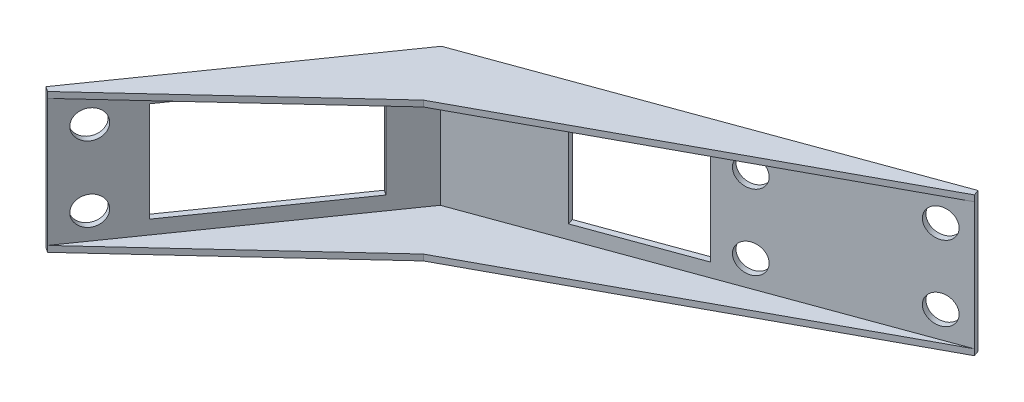
ISO-10303-21;
HEADER;
FILE_DESCRIPTION(('STEP AP214'),'2;1');
FILE_NAME('part.step','',(''),(''),'','','');
FILE_SCHEMA(('AUTOMOTIVE_DESIGN { 1 0 10303 214 1 1 1 1 }'));
ENDSEC;
DATA;
#1=APPLICATION_CONTEXT('core data for automotive mechanical design processes');
#2=APPLICATION_PROTOCOL_DEFINITION('international standard','automotive_design',2000,#1);
#3=PRODUCT_CONTEXT('',#1,'mechanical');
#4=PRODUCT('Part','Part','',(#3));
#5=PRODUCT_RELATED_PRODUCT_CATEGORY('part','',(#4));
#6=PRODUCT_DEFINITION_FORMATION('','',#4);
#7=PRODUCT_DEFINITION_CONTEXT('part definition',#1,'design');
#8=PRODUCT_DEFINITION('design','',#6,#7);
#9=PRODUCT_DEFINITION_SHAPE('','',#8);
#10=(LENGTH_UNIT() NAMED_UNIT(*) SI_UNIT(.MILLI.,.METRE.));
#11=(NAMED_UNIT(*) PLANE_ANGLE_UNIT() SI_UNIT($,.RADIAN.));
#12=(NAMED_UNIT(*) SI_UNIT($,.STERADIAN.) SOLID_ANGLE_UNIT());
#13=UNCERTAINTY_MEASURE_WITH_UNIT(LENGTH_MEASURE(1.E-05),#10,'distance_accuracy_value','');
#14=(GEOMETRIC_REPRESENTATION_CONTEXT(3) GLOBAL_UNCERTAINTY_ASSIGNED_CONTEXT((#13)) GLOBAL_UNIT_ASSIGNED_CONTEXT((#10,
#11,#12)) REPRESENTATION_CONTEXT('',''));
#15=CARTESIAN_POINT('',(0.,0.,0.));
#16=DIRECTION('',(0.,0.,1.));
#17=DIRECTION('',(1.,0.,0.));
#18=AXIS2_PLACEMENT_3D('',#15,#16,#17);
#19=CARTESIAN_POINT('',(65.7404837524063,26.65,-35.7689616644613));
#20=DIRECTION('',(-0.939464857122452,0.,0.342645271719736));
#21=DIRECTION('',(0.342645271719736,0.,0.939464857122451));
#22=AXIS2_PLACEMENT_3D('',#19,#20,#21);
#23=PLANE('',#22);
#24=DIRECTION('',(0.,-1.,0.));
#25=VECTOR('',#24,1.);
#26=CARTESIAN_POINT('',(65.7404837524063,26.65,-35.7689616644613));
#27=LINE('',#26,#25);
#28=CARTESIAN_POINT('',(65.7404837524063,26.65,-35.7689616644613));
#29=VERTEX_POINT('',#28);
#30=CARTESIAN_POINT('',(65.7404837524063,0.,-35.7689616644613));
#31=VERTEX_POINT('',#30);
#32=EDGE_CURVE('E223',#29,#31,#27,.T.);
#33=ORIENTED_EDGE('',*,*,#32,.T.);
#34=DIRECTION('',(0.,1.,0.));
#35=VECTOR('',#34,1.);
#36=CARTESIAN_POINT('',(65.7404837524063,-1.25,-35.7689616644613));
#37=LINE('',#36,#35);
#38=CARTESIAN_POINT('',(65.7404837524063,-1.25,-35.7689616644613));
#39=VERTEX_POINT('',#38);
#40=EDGE_CURVE('E175',#39,#31,#37,.T.);
#41=ORIENTED_EDGE('',*,*,#40,.F.);
#42=DIRECTION('',(0.342645271719736,0.,0.939464857122451));
#43=VECTOR('',#42,1.);
#44=CARTESIAN_POINT('',(65.3121771627561,-1.25,-36.943292735866));
#45=LINE('',#44,#43);
#46=CARTESIAN_POINT('',(65.3121771627561,-1.25,-36.943292735866));
#47=VERTEX_POINT('',#46);
#48=EDGE_CURVE('E190',#47,#39,#45,.T.);
#49=ORIENTED_EDGE('',*,*,#48,.F.);
#50=DIRECTION('',(0.,-1.,0.));
#51=VECTOR('',#50,1.);
#52=CARTESIAN_POINT('',(65.3121771627561,26.65,-36.943292735866));
#53=LINE('',#52,#51);
#54=CARTESIAN_POINT('',(65.3121771627561,27.9,-36.943292735866));
#55=VERTEX_POINT('',#54);
#56=EDGE_CURVE('E238',#55,#47,#53,.T.);
#57=ORIENTED_EDGE('',*,*,#56,.F.);
#58=DIRECTION('',(-0.342645271719736,0.,-0.939464857122451));
#59=VECTOR('',#58,1.);
#60=CARTESIAN_POINT('',(65.3121771627561,27.9,-36.943292735866));
#61=LINE('',#60,#59);
#62=CARTESIAN_POINT('',(65.7404837524063,27.9,-35.7689616644613));
#63=VERTEX_POINT('',#62);
#64=EDGE_CURVE('E204',#63,#55,#61,.T.);
#65=ORIENTED_EDGE('',*,*,#64,.F.);
#66=DIRECTION('',(0.,-1.,0.));
#67=VECTOR('',#66,1.);
#68=CARTESIAN_POINT('',(65.7404837524063,27.9,-35.7689616644613));
#69=LINE('',#68,#67);
#70=EDGE_CURVE('E210',#63,#29,#69,.T.);
#71=ORIENTED_EDGE('',*,*,#70,.T.);
#72=EDGE_LOOP('',(#33,#41,#49,#57,#65,#71));
#73=FACE_BOUND('',#72,.T.);
#74=ADVANCED_FACE('F41',(#73),#23,.F.);
#75=CARTESIAN_POINT('',(65.3121771627561,26.65,-36.943292735866));
#76=DIRECTION('',(0.342645271719738,0.,0.939464857122451));
#77=DIRECTION('',(0.939464857122451,0.,-0.342645271719738));
#78=AXIS2_PLACEMENT_3D('',#75,#76,#77);
#79=PLANE('',#78);
#80=DIRECTION('',(0.,-1.,0.));
#81=VECTOR('',#80,1.);
#82=CARTESIAN_POINT('',(24.832368991404,2.87421941666616,-22.1793398696355));
#83=LINE('',#82,#81);
#84=CARTESIAN_POINT('',(24.832368991404,23.7757805833338,-22.1793398696355));
#85=VERTEX_POINT('',#84);
#86=CARTESIAN_POINT('',(24.832368991404,2.87421941666616,-22.1793398696355));
#87=VERTEX_POINT('',#86);
#88=EDGE_CURVE('E362',#85,#87,#83,.T.);
#89=ORIENTED_EDGE('',*,*,#88,.F.);
#90=DIRECTION('',(0.939464857122451,0.,-0.342645271719738));
#91=VECTOR('',#90,1.);
#92=CARTESIAN_POINT('',(8.74010728041783,23.7757805833338,-16.3101076735159));
#93=LINE('',#92,#91);
#94=CARTESIAN_POINT('',(3.10331813768313,23.7757805833338,-14.2542360431975));
#95=VERTEX_POINT('',#94);
#96=EDGE_CURVE('E353',#95,#85,#93,.T.);
#97=ORIENTED_EDGE('',*,*,#96,.F.);
#98=DIRECTION('',(0.,1.,0.));
#99=VECTOR('',#98,1.);
#100=CARTESIAN_POINT('',(3.10331813768313,23.7757805833338,-14.2542360431975));
#101=LINE('',#100,#99);
#102=CARTESIAN_POINT('',(3.10331813768313,2.87421941666616,-14.2542360431975));
#103=VERTEX_POINT('',#102);
#104=EDGE_CURVE('E356',#103,#95,#101,.T.);
#105=ORIENTED_EDGE('',*,*,#104,.F.);
#106=DIRECTION('',(-0.939464857122451,0.,0.342645271719738));
#107=VECTOR('',#106,1.);
#108=CARTESIAN_POINT('',(3.10331813768313,2.87421941666616,-14.2542360431975));
#109=LINE('',#108,#107);
#110=EDGE_CURVE('E359',#87,#103,#109,.T.);
#111=ORIENTED_EDGE('',*,*,#110,.F.);
#112=EDGE_LOOP('',(#89,#97,#105,#111));
#113=FACE_BOUND('',#112,.T.);
#114=CARTESIAN_POINT('',(60.1451204485826,5.5,-35.0587437414075));
#115=DIRECTION('',(-0.342645271719738,0.,-0.939464857122451));
#116=DIRECTION('',(-0.939464857122451,0.,0.342645271719738));
#117=AXIS2_PLACEMENT_3D('',#114,#115,#116);
#118=CIRCLE('',#117,3.00000000000001);
#119=CARTESIAN_POINT('',(57.3267258772152,5.5,-34.0308079262482));
#120=VERTEX_POINT('',#119);
#121=EDGE_CURVE('E284',#120,#120,#118,.T.);
#122=ORIENTED_EDGE('',*,*,#121,.F.);
#123=EDGE_LOOP('',(#122));
#124=FACE_BOUND('',#123,.T.);
#125=CARTESIAN_POINT('',(31.0217098777866,5.5,-24.4367403180956));
#126=DIRECTION('',(-0.342645271719738,0.,-0.939464857122451));
#127=DIRECTION('',(-0.939464857122451,0.,0.342645271719738));
#128=AXIS2_PLACEMENT_3D('',#125,#126,#127);
#129=CIRCLE('',#128,3.);
#130=CARTESIAN_POINT('',(28.2033153064193,5.5,-23.4088045029363));
#131=VERTEX_POINT('',#130);
#132=EDGE_CURVE('E291',#131,#131,#129,.T.);
#133=ORIENTED_EDGE('',*,*,#132,.F.);
#134=EDGE_LOOP('',(#133));
#135=FACE_BOUND('',#134,.T.);
#136=CARTESIAN_POINT('',(31.0217098777866,21.15,-24.4367403180956));
#137=DIRECTION('',(-0.342645271719738,0.,-0.939464857122451));
#138=DIRECTION('',(-0.939464857122451,0.,0.342645271719738));
#139=AXIS2_PLACEMENT_3D('',#136,#137,#138);
#140=CIRCLE('',#139,3.);
#141=CARTESIAN_POINT('',(28.2033153064193,21.15,-23.4088045029363));
#142=VERTEX_POINT('',#141);
#143=EDGE_CURVE('E297',#142,#142,#140,.T.);
#144=ORIENTED_EDGE('',*,*,#143,.F.);
#145=EDGE_LOOP('',(#144));
#146=FACE_BOUND('',#145,.T.);
#147=CARTESIAN_POINT('',(60.1451204485826,21.15,-35.0587437414075));
#148=DIRECTION('',(-0.342645271719738,0.,-0.939464857122451));
#149=DIRECTION('',(-0.939464857122451,0.,0.342645271719738));
#150=AXIS2_PLACEMENT_3D('',#147,#148,#149);
#151=CIRCLE('',#150,3.00000000000001);
#152=CARTESIAN_POINT('',(57.3267258772152,21.15,-34.0308079262482));
#153=VERTEX_POINT('',#152);
#154=EDGE_CURVE('E278',#153,#153,#151,.T.);
#155=ORIENTED_EDGE('',*,*,#154,.F.);
#156=EDGE_LOOP('',(#155));
#157=FACE_BOUND('',#156,.T.);
#158=ORIENTED_EDGE('',*,*,#56,.T.);
#159=DIRECTION('',(0.939464857122451,0.,-0.342645271719738));
#160=VECTOR('',#159,1.);
#161=CARTESIAN_POINT('',(-16.9541074083159,-1.25,-6.93881389184875));
#162=LINE('',#161,#160);
#163=CARTESIAN_POINT('',(-16.9541074083159,-1.25,-6.93881389184875));
#164=VERTEX_POINT('',#163);
#165=EDGE_CURVE('E193',#164,#47,#162,.T.);
#166=ORIENTED_EDGE('',*,*,#165,.F.);
#167=DIRECTION('',(0.,-1.,0.));
#168=VECTOR('',#167,1.);
#169=CARTESIAN_POINT('',(-16.9541074083159,26.65,-6.93881389184875));
#170=LINE('',#169,#168);
#171=CARTESIAN_POINT('',(-16.9541074083159,27.9,-6.93881389184875));
#172=VERTEX_POINT('',#171);
#173=EDGE_CURVE('E236',#172,#164,#170,.T.);
#174=ORIENTED_EDGE('',*,*,#173,.F.);
#175=DIRECTION('',(-0.939464857122451,0.,0.342645271719738));
#176=VECTOR('',#175,1.);
#177=CARTESIAN_POINT('',(-16.9541074083159,27.9,-6.93881389184875));
#178=LINE('',#177,#176);
#179=EDGE_CURVE('E207',#55,#172,#178,.T.);
#180=ORIENTED_EDGE('',*,*,#179,.F.);
#181=EDGE_LOOP('',(#158,#166,#174,#180));
#182=FACE_BOUND('',#181,.T.);
#183=ADVANCED_FACE('F274',(#113,#124,#135,#146,#157,#182),#79,.F.);
#184=CARTESIAN_POINT('',(-51.0024738479846,26.65,41.7537327906224));
#185=DIRECTION('',(0.819519758435862,0.,0.573050927521478));
#186=DIRECTION('',(0.573050927521478,0.,-0.819519758435862));
#187=AXIS2_PLACEMENT_3D('',#184,#185,#186);
#188=PLANE('',#187);
#189=DIRECTION('',(0.573050927521478,0.,-0.819519758435862));
#190=VECTOR('',#189,1.);
#191=CARTESIAN_POINT('',(-21.8711764349884,23.7757805833338,0.0930833225573913));
#192=LINE('',#191,#190);
#193=CARTESIAN_POINT('',(-42.1969008210796,23.7757805833338,29.1608885366045));
#194=VERTEX_POINT('',#193);
#195=CARTESIAN_POINT('',(-21.8711764349884,23.7757805833338,0.0930833225573913));
#196=VERTEX_POINT('',#195);
#197=EDGE_CURVE('E330',#194,#196,#192,.T.);
#198=ORIENTED_EDGE('',*,*,#197,.F.);
#199=DIRECTION('',(0.,1.,0.));
#200=VECTOR('',#199,1.);
#201=CARTESIAN_POINT('',(-42.1969008210796,2.87421941666616,29.1608885366045));
#202=LINE('',#201,#200);
#203=CARTESIAN_POINT('',(-42.1969008210796,2.87421941666616,29.1608885366045));
#204=VERTEX_POINT('',#203);
#205=EDGE_CURVE('E333',#204,#194,#202,.T.);
#206=ORIENTED_EDGE('',*,*,#205,.F.);
#207=DIRECTION('',(-0.573050927521478,0.,0.819519758435862));
#208=VECTOR('',#207,1.);
#209=CARTESIAN_POINT('',(-21.8711764349884,2.87421941666616,0.0930833225573913));
#210=LINE('',#209,#208);
#211=CARTESIAN_POINT('',(-21.8711764349884,2.87421941666616,0.0930833225573913));
#212=VERTEX_POINT('',#211);
#213=EDGE_CURVE('E323',#212,#204,#210,.T.);
#214=ORIENTED_EDGE('',*,*,#213,.F.);
#215=DIRECTION('',(0.,-1.,0.));
#216=VECTOR('',#215,1.);
#217=CARTESIAN_POINT('',(-21.8711764349884,2.87421941666616,0.0930833225573913));
#218=LINE('',#217,#216);
#219=EDGE_CURVE('E327',#196,#212,#218,.T.);
#220=ORIENTED_EDGE('',*,*,#219,.F.);
#221=EDGE_LOOP('',(#198,#206,#214,#220));
#222=FACE_BOUND('',#221,.T.);
#223=CARTESIAN_POINT('',(-47.3636004582232,21.15,36.5497823245547));
#224=DIRECTION('',(-0.819519758435862,0.,-0.573050927521478));
#225=DIRECTION('',(-0.573050927521478,0.,0.819519758435862));
#226=AXIS2_PLACEMENT_3D('',#223,#224,#225);
#227=CIRCLE('',#226,3.);
#228=CARTESIAN_POINT('',(-49.0827532407876,21.15,39.0083415998623));
#229=VERTEX_POINT('',#228);
#230=EDGE_CURVE('E309',#229,#229,#227,.T.);
#231=ORIENTED_EDGE('',*,*,#230,.F.);
#232=EDGE_LOOP('',(#231));
#233=FACE_BOUND('',#232,.T.);
#234=CARTESIAN_POINT('',(-47.3636004582232,5.5,36.5497823245547));
#235=DIRECTION('',(-0.819519758435862,0.,-0.573050927521478));
#236=DIRECTION('',(-0.573050927521478,0.,0.819519758435862));
#237=AXIS2_PLACEMENT_3D('',#234,#235,#236);
#238=CIRCLE('',#237,3.);
#239=CARTESIAN_POINT('',(-49.0827532407876,5.5,39.0083415998623));
#240=VERTEX_POINT('',#239);
#241=EDGE_CURVE('E302',#240,#240,#238,.T.);
#242=ORIENTED_EDGE('',*,*,#241,.F.);
#243=EDGE_LOOP('',(#242));
#244=FACE_BOUND('',#243,.T.);
#245=ORIENTED_EDGE('',*,*,#173,.T.);
#246=DIRECTION('',(0.573050927521478,0.,-0.819519758435862));
#247=VECTOR('',#246,1.);
#248=CARTESIAN_POINT('',(-51.0024738479846,-1.25,41.7537327906224));
#249=LINE('',#248,#247);
#250=CARTESIAN_POINT('',(-51.0024738479846,-1.25,41.7537327906224));
#251=VERTEX_POINT('',#250);
#252=EDGE_CURVE('E176',#251,#164,#249,.T.);
#253=ORIENTED_EDGE('',*,*,#252,.F.);
#254=DIRECTION('',(0.,-1.,0.));
#255=VECTOR('',#254,1.);
#256=CARTESIAN_POINT('',(-51.0024738479846,26.65,41.7537327906224));
#257=LINE('',#256,#255);
#258=CARTESIAN_POINT('',(-51.0024738479846,27.9,41.7537327906224));
#259=VERTEX_POINT('',#258);
#260=EDGE_CURVE('E189',#259,#251,#257,.T.);
#261=ORIENTED_EDGE('',*,*,#260,.F.);
#262=DIRECTION('',(-0.573050927521478,0.,0.819519758435862));
#263=VECTOR('',#262,1.);
#264=CARTESIAN_POINT('',(-51.0024738479846,27.9,41.7537327906224));
#265=LINE('',#264,#263);
#266=EDGE_CURVE('E198',#172,#259,#265,.T.);
#267=ORIENTED_EDGE('',*,*,#266,.F.);
#268=EDGE_LOOP('',(#245,#253,#261,#267));
#269=FACE_BOUND('',#268,.T.);
#270=ADVANCED_FACE('F270',(#222,#233,#244,#269),#188,.F.);
#271=CARTESIAN_POINT('',(-49.9780741499398,26.65,42.4700464500242));
#272=DIRECTION('',(0.573050927521479,0.,-0.819519758435861));
#273=DIRECTION('',(-0.819519758435861,0.,-0.573050927521479));
#274=AXIS2_PLACEMENT_3D('',#271,#272,#273);
#275=PLANE('',#274);
#276=ORIENTED_EDGE('',*,*,#260,.T.);
#277=DIRECTION('',(-0.819519758435861,0.,-0.573050927521479));
#278=VECTOR('',#277,1.);
#279=CARTESIAN_POINT('',(-49.9780741499398,-1.25,42.4700464500242));
#280=LINE('',#279,#278);
#281=CARTESIAN_POINT('',(-49.9780741499398,-1.25,42.4700464500242));
#282=VERTEX_POINT('',#281);
#283=EDGE_CURVE('E182',#282,#251,#280,.T.);
#284=ORIENTED_EDGE('',*,*,#283,.F.);
#285=DIRECTION('',(0.,1.,0.));
#286=VECTOR('',#285,1.);
#287=CARTESIAN_POINT('',(-49.9780741499398,-1.25,42.4700464500242));
#288=LINE('',#287,#286);
#289=CARTESIAN_POINT('',(-49.9780741499398,0.,42.4700464500242));
#290=VERTEX_POINT('',#289);
#291=EDGE_CURVE('E164',#282,#290,#288,.T.);
#292=ORIENTED_EDGE('',*,*,#291,.T.);
#293=DIRECTION('',(0.,-1.,0.));
#294=VECTOR('',#293,1.);
#295=CARTESIAN_POINT('',(-49.9780741499398,26.65,42.4700464500242));
#296=LINE('',#295,#294);
#297=CARTESIAN_POINT('',(-49.9780741499398,26.65,42.4700464500242));
#298=VERTEX_POINT('',#297);
#299=EDGE_CURVE('E233',#298,#290,#296,.T.);
#300=ORIENTED_EDGE('',*,*,#299,.F.);
#301=DIRECTION('',(0.,-1.,0.));
#302=VECTOR('',#301,1.);
#303=CARTESIAN_POINT('',(-49.9780741499398,27.9,42.4700464500242));
#304=LINE('',#303,#302);
#305=CARTESIAN_POINT('',(-49.9780741499398,27.9,42.4700464500242));
#306=VERTEX_POINT('',#305);
#307=EDGE_CURVE('E213',#306,#298,#304,.T.);
#308=ORIENTED_EDGE('',*,*,#307,.F.);
#309=DIRECTION('',(0.819519758435861,0.,0.573050927521479));
#310=VECTOR('',#309,1.);
#311=CARTESIAN_POINT('',(-51.0024738479846,27.9,41.7537327906224));
#312=LINE('',#311,#310);
#313=EDGE_CURVE('E201',#259,#306,#312,.T.);
#314=ORIENTED_EDGE('',*,*,#313,.F.);
#315=EDGE_LOOP('',(#276,#284,#292,#300,#308,#314));
#316=FACE_BOUND('',#315,.T.);
#317=ADVANCED_FACE('F187',(#316),#275,.F.);
#318=CARTESIAN_POINT('',(-49.9780741499398,26.65,42.4700464500242));
#319=DIRECTION('',(-0.819519758435862,0.,-0.573050927521478));
#320=DIRECTION('',(-0.573050927521478,0.,0.819519758435862));
#321=AXIS2_PLACEMENT_3D('',#318,#319,#320);
#322=PLANE('',#321);
#323=DIRECTION('',(-0.573050927521478,0.,0.819519758435862));
#324=VECTOR('',#323,1.);
#325=CARTESIAN_POINT('',(-20.8467767369436,2.87421941666616,0.809396981959239));
#326=LINE('',#325,#324);
#327=CARTESIAN_POINT('',(-20.8467767369436,2.87421941666616,0.809396981959239));
#328=VERTEX_POINT('',#327);
#329=CARTESIAN_POINT('',(-41.1725011230348,2.87421941666616,29.8772021960063));
#330=VERTEX_POINT('',#329);
#331=EDGE_CURVE('E318',#328,#330,#326,.T.);
#332=ORIENTED_EDGE('',*,*,#331,.T.);
#333=DIRECTION('',(0.,1.,0.));
#334=VECTOR('',#333,1.);
#335=CARTESIAN_POINT('',(-41.1725011230348,2.87421941666616,29.8772021960063));
#336=LINE('',#335,#334);
#337=CARTESIAN_POINT('',(-41.1725011230348,23.7757805833338,29.8772021960063));
#338=VERTEX_POINT('',#337);
#339=EDGE_CURVE('E326',#330,#338,#336,.T.);
#340=ORIENTED_EDGE('',*,*,#339,.T.);
#341=DIRECTION('',(0.573050927521478,0.,-0.819519758435862));
#342=VECTOR('',#341,1.);
#343=CARTESIAN_POINT('',(-20.8467767369436,23.7757805833338,0.809396981959239));
#344=LINE('',#343,#342);
#345=CARTESIAN_POINT('',(-20.8467767369436,23.7757805833338,0.809396981959074));
#346=VERTEX_POINT('',#345);
#347=EDGE_CURVE('E341',#338,#346,#344,.T.);
#348=ORIENTED_EDGE('',*,*,#347,.T.);
#349=DIRECTION('',(0.,-1.,0.));
#350=VECTOR('',#349,1.);
#351=CARTESIAN_POINT('',(-20.8467767369436,2.87421941666616,0.809396981959239));
#352=LINE('',#351,#350);
#353=EDGE_CURVE('E338',#346,#328,#352,.T.);
#354=ORIENTED_EDGE('',*,*,#353,.T.);
#355=EDGE_LOOP('',(#332,#340,#348,#354));
#356=FACE_BOUND('',#355,.T.);
#357=CARTESIAN_POINT('',(-46.3392007601784,21.15,37.2660959839566));
#358=DIRECTION('',(-0.819519758435862,0.,-0.573050927521478));
#359=DIRECTION('',(-0.573050927521478,0.,0.819519758435862));
#360=AXIS2_PLACEMENT_3D('',#357,#358,#359);
#361=CIRCLE('',#360,3.);
#362=CARTESIAN_POINT('',(-48.0583535427428,21.15,39.7246552592642));
#363=VERTEX_POINT('',#362);
#364=EDGE_CURVE('E288',#363,#363,#361,.T.);
#365=ORIENTED_EDGE('',*,*,#364,.T.);
#366=EDGE_LOOP('',(#365));
#367=FACE_BOUND('',#366,.T.);
#368=CARTESIAN_POINT('',(-46.3392007601784,5.5,37.2660959839566));
#369=DIRECTION('',(-0.819519758435862,0.,-0.573050927521478));
#370=DIRECTION('',(-0.573050927521478,0.,0.819519758435862));
#371=AXIS2_PLACEMENT_3D('',#368,#369,#370);
#372=CIRCLE('',#371,3.);
#373=CARTESIAN_POINT('',(-48.0583535427428,5.5,39.7246552592642));
#374=VERTEX_POINT('',#373);
#375=EDGE_CURVE('E305',#374,#374,#372,.T.);
#376=ORIENTED_EDGE('',*,*,#375,.T.);
#377=EDGE_LOOP('',(#376));
#378=FACE_BOUND('',#377,.T.);
#379=DIRECTION('',(0.573050927521478,0.,-0.819519758435862));
#380=VECTOR('',#379,1.);
#381=CARTESIAN_POINT('',(-49.9780741499398,0.,42.4700464500242));
#382=LINE('',#381,#380);
#383=CARTESIAN_POINT('',(-16.1555511111306,0.,-5.89952173188478));
#384=VERTEX_POINT('',#383);
#385=EDGE_CURVE('E215',#290,#384,#382,.T.);
#386=ORIENTED_EDGE('',*,*,#385,.T.);
#387=DIRECTION('',(0.,-1.,0.));
#388=VECTOR('',#387,1.);
#389=CARTESIAN_POINT('',(-16.1555511111306,26.65,-5.89952173188478));
#390=LINE('',#389,#388);
#391=CARTESIAN_POINT('',(-16.1555511111306,26.65,-5.89952173188478));
#392=VERTEX_POINT('',#391);
#393=EDGE_CURVE('E230',#392,#384,#390,.T.);
#394=ORIENTED_EDGE('',*,*,#393,.F.);
#395=DIRECTION('',(0.573050927521478,0.,-0.819519758435862));
#396=VECTOR('',#395,1.);
#397=CARTESIAN_POINT('',(-49.9780741499398,26.65,42.4700464500242));
#398=LINE('',#397,#396);
#399=EDGE_CURVE('E216',#298,#392,#398,.T.);
#400=ORIENTED_EDGE('',*,*,#399,.F.);
#401=ORIENTED_EDGE('',*,*,#299,.T.);
#402=EDGE_LOOP('',(#386,#394,#400,#401));
#403=FACE_BOUND('',#402,.T.);
#404=ADVANCED_FACE('F242',(#356,#367,#378,#403),#322,.F.);
#405=CARTESIAN_POINT('',(65.7404837524063,26.65,-35.7689616644613));
#406=DIRECTION('',(-0.342645271719737,0.,-0.939464857122451));
#407=DIRECTION('',(-0.939464857122451,0.,0.342645271719737));
#408=AXIS2_PLACEMENT_3D('',#405,#406,#407);
#409=PLANE('',#408);
#410=DIRECTION('',(0.,1.,0.));
#411=VECTOR('',#410,1.);
#412=CARTESIAN_POINT('',(3.5316247273328,23.7757805833338,-13.0799049717944));
#413=LINE('',#412,#411);
#414=CARTESIAN_POINT('',(3.5316247273328,2.87421941666616,-13.0799049717944));
#415=VERTEX_POINT('',#414);
#416=CARTESIAN_POINT('',(3.5316247273328,23.7757805833338,-13.0799049717944));
#417=VERTEX_POINT('',#416);
#418=EDGE_CURVE('E348',#415,#417,#413,.T.);
#419=ORIENTED_EDGE('',*,*,#418,.T.);
#420=DIRECTION('',(0.939464857122451,0.,-0.342645271719739));
#421=VECTOR('',#420,1.);
#422=CARTESIAN_POINT('',(25.2606755810537,23.7757805833338,-21.0050087982325));
#423=LINE('',#422,#421);
#424=CARTESIAN_POINT('',(25.2606755810537,23.7757805833338,-21.0050087982325));
#425=VERTEX_POINT('',#424);
#426=EDGE_CURVE('E355',#417,#425,#423,.T.);
#427=ORIENTED_EDGE('',*,*,#426,.T.);
#428=DIRECTION('',(0.,-1.,0.));
#429=VECTOR('',#428,1.);
#430=CARTESIAN_POINT('',(25.2606755810537,2.87421941666616,-21.0050087982325));
#431=LINE('',#430,#429);
#432=CARTESIAN_POINT('',(25.2606755810542,2.87421941666616,-21.0050087982309));
#433=VERTEX_POINT('',#432);
#434=EDGE_CURVE('E370',#425,#433,#431,.T.);
#435=ORIENTED_EDGE('',*,*,#434,.T.);
#436=DIRECTION('',(-0.939464857122451,0.,0.342645271719739));
#437=VECTOR('',#436,1.);
#438=CARTESIAN_POINT('',(25.2606755810537,2.87421941666616,-21.0050087982325));
#439=LINE('',#438,#437);
#440=EDGE_CURVE('E367',#433,#415,#439,.T.);
#441=ORIENTED_EDGE('',*,*,#440,.T.);
#442=EDGE_LOOP('',(#419,#427,#435,#441));
#443=FACE_BOUND('',#442,.T.);
#444=CARTESIAN_POINT('',(60.5734270382323,5.5,-33.8844126700044));
#445=DIRECTION('',(-0.342645271719738,0.,-0.939464857122451));
#446=DIRECTION('',(-0.939464857122451,0.,0.342645271719738));
#447=AXIS2_PLACEMENT_3D('',#444,#445,#446);
#448=CIRCLE('',#447,3.00000000000001);
#449=CARTESIAN_POINT('',(57.7550324668649,5.5,-32.8564768548452));
#450=VERTEX_POINT('',#449);
#451=EDGE_CURVE('E287',#450,#450,#448,.T.);
#452=ORIENTED_EDGE('',*,*,#451,.T.);
#453=EDGE_LOOP('',(#452));
#454=FACE_BOUND('',#453,.T.);
#455=CARTESIAN_POINT('',(31.4500164674363,5.5,-23.2624092466925));
#456=DIRECTION('',(-0.342645271719738,0.,-0.939464857122451));
#457=DIRECTION('',(-0.939464857122451,0.,0.342645271719738));
#458=AXIS2_PLACEMENT_3D('',#455,#456,#457);
#459=CIRCLE('',#458,3.);
#460=CARTESIAN_POINT('',(28.6316218960689,5.5,-22.2344734315333));
#461=VERTEX_POINT('',#460);
#462=EDGE_CURVE('E294',#461,#461,#459,.T.);
#463=ORIENTED_EDGE('',*,*,#462,.T.);
#464=EDGE_LOOP('',(#463));
#465=FACE_BOUND('',#464,.T.);
#466=CARTESIAN_POINT('',(31.4500164674363,21.15,-23.2624092466925));
#467=DIRECTION('',(-0.342645271719738,0.,-0.939464857122451));
#468=DIRECTION('',(-0.939464857122451,0.,0.342645271719738));
#469=AXIS2_PLACEMENT_3D('',#466,#467,#468);
#470=CIRCLE('',#469,3.);
#471=CARTESIAN_POINT('',(28.6316218960689,21.15,-22.2344734315333));
#472=VERTEX_POINT('',#471);
#473=EDGE_CURVE('E282',#472,#472,#470,.T.);
#474=ORIENTED_EDGE('',*,*,#473,.T.);
#475=EDGE_LOOP('',(#474));
#476=FACE_BOUND('',#475,.T.);
#477=CARTESIAN_POINT('',(60.5734270382323,21.15,-33.8844126700044));
#478=DIRECTION('',(-0.342645271719738,0.,-0.939464857122451));
#479=DIRECTION('',(-0.939464857122451,0.,0.342645271719738));
#480=AXIS2_PLACEMENT_3D('',#477,#478,#479);
#481=CIRCLE('',#480,3.00000000000001);
#482=CARTESIAN_POINT('',(57.7550324668649,21.15,-32.8564768548452));
#483=VERTEX_POINT('',#482);
#484=EDGE_CURVE('E276',#483,#483,#481,.T.);
#485=ORIENTED_EDGE('',*,*,#484,.T.);
#486=EDGE_LOOP('',(#485));
#487=FACE_BOUND('',#486,.T.);
#488=DIRECTION('',(0.939464857122451,0.,-0.342645271719737));
#489=VECTOR('',#488,1.);
#490=CARTESIAN_POINT('',(65.7404837524063,0.,-35.7689616644613));
#491=LINE('',#490,#489);
#492=EDGE_CURVE('E220',#384,#31,#491,.T.);
#493=ORIENTED_EDGE('',*,*,#492,.T.);
#494=ORIENTED_EDGE('',*,*,#32,.F.);
#495=DIRECTION('',(0.939464857122451,0.,-0.342645271719737));
#496=VECTOR('',#495,1.);
#497=CARTESIAN_POINT('',(65.7404837524063,26.65,-35.7689616644613));
#498=LINE('',#497,#496);
#499=EDGE_CURVE('E219',#392,#29,#498,.T.);
#500=ORIENTED_EDGE('',*,*,#499,.F.);
#501=ORIENTED_EDGE('',*,*,#393,.T.);
#502=EDGE_LOOP('',(#493,#494,#500,#501));
#503=FACE_BOUND('',#502,.T.);
#504=ADVANCED_FACE('F246',(#443,#454,#465,#476,#487,#503),#409,.F.);
#505=CARTESIAN_POINT('',(0.,27.9,0.));
#506=DIRECTION('',(0.,-1.,0.));
#507=DIRECTION('',(0.,0.,-1.));
#508=AXIS2_PLACEMENT_3D('',#505,#506,#507);
#509=PLANE('',#508);
#510=DIRECTION('',(0.734647099346202,0.,-0.678449437631288));
#511=VECTOR('',#510,1.);
#512=CARTESIAN_POINT('',(-1.83663038259005,27.9,-1.98876306516178));
#513=LINE('',#512,#511);
#514=CARTESIAN_POINT('',(-9.08282310460395,27.9,4.7031239396238));
#515=VERTEX_POINT('',#514);
#516=EDGE_CURVE('E257',#306,#515,#513,.T.);
#517=ORIENTED_EDGE('',*,*,#516,.T.);
#518=DIRECTION('',(0.879573438435132,0.,-0.475763141068536));
#519=VECTOR('',#518,1.);
#520=CARTESIAN_POINT('',(-0.0877923607328361,27.9,-0.162307295232428));
#521=LINE('',#520,#519);
#522=EDGE_CURVE('E364',#515,#63,#521,.T.);
#523=ORIENTED_EDGE('',*,*,#522,.T.);
#524=ORIENTED_EDGE('',*,*,#64,.T.);
#525=ORIENTED_EDGE('',*,*,#179,.T.);
#526=ORIENTED_EDGE('',*,*,#266,.T.);
#527=ORIENTED_EDGE('',*,*,#313,.T.);
#528=EDGE_LOOP('',(#517,#523,#524,#525,#526,#527));
#529=FACE_BOUND('',#528,.T.);
#530=ADVANCED_FACE('F266',(#529),#509,.F.);
#531=CARTESIAN_POINT('',(0.,26.65,0.));
#532=DIRECTION('',(0.,-1.,0.));
#533=DIRECTION('',(0.,0.,-1.));
#534=AXIS2_PLACEMENT_3D('',#531,#532,#533);
#535=PLANE('',#534);
#536=DIRECTION('',(0.879573438435132,0.,-0.475763141068536));
#537=VECTOR('',#536,1.);
#538=CARTESIAN_POINT('',(-0.0877923607328361,26.65,-0.162307295232428));
#539=LINE('',#538,#537);
#540=CARTESIAN_POINT('',(-9.08282310460395,26.65,4.7031239396238));
#541=VERTEX_POINT('',#540);
#542=EDGE_CURVE('E253',#541,#29,#539,.T.);
#543=ORIENTED_EDGE('',*,*,#542,.F.);
#544=DIRECTION('',(0.734647099346202,0.,-0.678449437631288));
#545=VECTOR('',#544,1.);
#546=CARTESIAN_POINT('',(-1.83663038259005,26.65,-1.98876306516178));
#547=LINE('',#546,#545);
#548=EDGE_CURVE('E252',#298,#541,#547,.T.);
#549=ORIENTED_EDGE('',*,*,#548,.F.);
#550=ORIENTED_EDGE('',*,*,#399,.T.);
#551=ORIENTED_EDGE('',*,*,#499,.T.);
#552=EDGE_LOOP('',(#543,#549,#550,#551));
#553=FACE_BOUND('',#552,.T.);
#554=ADVANCED_FACE('F251',(#553),#535,.T.);
#555=CARTESIAN_POINT('',(0.,-1.25,0.));
#556=DIRECTION('',(0.,-1.,0.));
#557=DIRECTION('',(0.,0.,-1.));
#558=AXIS2_PLACEMENT_3D('',#555,#556,#557);
#559=PLANE('',#558);
#560=DIRECTION('',(0.879573438435132,0.,-0.475763141068536));
#561=VECTOR('',#560,1.);
#562=CARTESIAN_POINT('',(65.7404837524063,-1.25,-35.7689616644613));
#563=LINE('',#562,#561);
#564=CARTESIAN_POINT('',(-9.08282310460395,-1.25,4.7031239396238));
#565=VERTEX_POINT('',#564);
#566=EDGE_CURVE('E185',#565,#39,#563,.T.);
#567=ORIENTED_EDGE('',*,*,#566,.F.);
#568=DIRECTION('',(0.734647099346202,0.,-0.678449437631288));
#569=VECTOR('',#568,1.);
#570=CARTESIAN_POINT('',(-9.08282310460395,-1.25,4.7031239396238));
#571=LINE('',#570,#569);
#572=EDGE_CURVE('E167',#282,#565,#571,.T.);
#573=ORIENTED_EDGE('',*,*,#572,.F.);
#574=ORIENTED_EDGE('',*,*,#283,.T.);
#575=ORIENTED_EDGE('',*,*,#252,.T.);
#576=ORIENTED_EDGE('',*,*,#165,.T.);
#577=ORIENTED_EDGE('',*,*,#48,.T.);
#578=EDGE_LOOP('',(#567,#573,#574,#575,#576,#577));
#579=FACE_BOUND('',#578,.T.);
#580=ADVANCED_FACE('F180',(#579),#559,.T.);
#581=CARTESIAN_POINT('',(0.,0.,0.));
#582=DIRECTION('',(0.,-1.,0.));
#583=DIRECTION('',(0.,0.,-1.));
#584=AXIS2_PLACEMENT_3D('',#581,#582,#583);
#585=PLANE('',#584);
#586=DIRECTION('',(0.734647099346202,0.,-0.678449437631288));
#587=VECTOR('',#586,1.);
#588=CARTESIAN_POINT('',(-1.83663038259005,0.,-1.98876306516178));
#589=LINE('',#588,#587);
#590=CARTESIAN_POINT('',(-9.08282310460395,0.,4.7031239396238));
#591=VERTEX_POINT('',#590);
#592=EDGE_CURVE('E48',#290,#591,#589,.T.);
#593=ORIENTED_EDGE('',*,*,#592,.T.);
#594=DIRECTION('',(0.879573438435132,0.,-0.475763141068536));
#595=VECTOR('',#594,1.);
#596=CARTESIAN_POINT('',(-0.0877923607328361,0.,-0.162307295232428));
#597=LINE('',#596,#595);
#598=EDGE_CURVE('E11',#591,#31,#597,.T.);
#599=ORIENTED_EDGE('',*,*,#598,.T.);
#600=ORIENTED_EDGE('',*,*,#492,.F.);
#601=ORIENTED_EDGE('',*,*,#385,.F.);
#602=EDGE_LOOP('',(#593,#599,#600,#601));
#603=FACE_BOUND('',#602,.T.);
#604=ADVANCED_FACE('F240',(#603),#585,.F.);
#605=CARTESIAN_POINT('',(60.5734270382323,21.15,-33.8844126700044));
#606=DIRECTION('',(-0.342645271719738,0.,-0.939464857122451));
#607=DIRECTION('',(-0.939464857122451,0.,0.342645271719738));
#608=AXIS2_PLACEMENT_3D('',#605,#606,#607);
#609=CYLINDRICAL_SURFACE('',#608,3.00000000000001);
#610=ORIENTED_EDGE('',*,*,#484,.F.);
#611=EDGE_LOOP('',(#610));
#612=FACE_BOUND('',#611,.T.);
#613=ORIENTED_EDGE('',*,*,#154,.T.);
#614=EDGE_LOOP('',(#613));
#615=FACE_BOUND('',#614,.T.);
#616=ADVANCED_FACE('F419',(#612,#615),#609,.F.);
#617=CARTESIAN_POINT('',(31.4500164674363,21.15,-23.2624092466925));
#618=DIRECTION('',(-0.342645271719738,0.,-0.939464857122451));
#619=DIRECTION('',(-0.939464857122451,0.,0.342645271719738));
#620=AXIS2_PLACEMENT_3D('',#617,#618,#619);
#621=CYLINDRICAL_SURFACE('',#620,3.);
#622=ORIENTED_EDGE('',*,*,#473,.F.);
#623=EDGE_LOOP('',(#622));
#624=FACE_BOUND('',#623,.T.);
#625=ORIENTED_EDGE('',*,*,#143,.T.);
#626=EDGE_LOOP('',(#625));
#627=FACE_BOUND('',#626,.T.);
#628=ADVANCED_FACE('F424',(#624,#627),#621,.F.);
#629=CARTESIAN_POINT('',(31.4500164674363,5.5,-23.2624092466925));
#630=DIRECTION('',(-0.342645271719738,0.,-0.939464857122451));
#631=DIRECTION('',(-0.939464857122451,0.,0.342645271719738));
#632=AXIS2_PLACEMENT_3D('',#629,#630,#631);
#633=CYLINDRICAL_SURFACE('',#632,3.);
#634=ORIENTED_EDGE('',*,*,#462,.F.);
#635=EDGE_LOOP('',(#634));
#636=FACE_BOUND('',#635,.T.);
#637=ORIENTED_EDGE('',*,*,#132,.T.);
#638=EDGE_LOOP('',(#637));
#639=FACE_BOUND('',#638,.T.);
#640=ADVANCED_FACE('F430',(#636,#639),#633,.F.);
#641=CARTESIAN_POINT('',(60.5734270382323,5.5,-33.8844126700044));
#642=DIRECTION('',(-0.342645271719738,0.,-0.939464857122451));
#643=DIRECTION('',(-0.939464857122451,0.,0.342645271719738));
#644=AXIS2_PLACEMENT_3D('',#641,#642,#643);
#645=CYLINDRICAL_SURFACE('',#644,3.00000000000001);
#646=ORIENTED_EDGE('',*,*,#451,.F.);
#647=EDGE_LOOP('',(#646));
#648=FACE_BOUND('',#647,.T.);
#649=ORIENTED_EDGE('',*,*,#121,.T.);
#650=EDGE_LOOP('',(#649));
#651=FACE_BOUND('',#650,.T.);
#652=ADVANCED_FACE('F426',(#648,#651),#645,.F.);
#653=CARTESIAN_POINT('',(-46.3392007601784,5.5,37.2660959839566));
#654=DIRECTION('',(-0.819519758435862,0.,-0.573050927521478));
#655=DIRECTION('',(-0.573050927521478,0.,0.819519758435862));
#656=AXIS2_PLACEMENT_3D('',#653,#654,#655);
#657=CYLINDRICAL_SURFACE('',#656,3.);
#658=ORIENTED_EDGE('',*,*,#375,.F.);
#659=EDGE_LOOP('',(#658));
#660=FACE_BOUND('',#659,.T.);
#661=ORIENTED_EDGE('',*,*,#241,.T.);
#662=EDGE_LOOP('',(#661));
#663=FACE_BOUND('',#662,.T.);
#664=ADVANCED_FACE('F429',(#660,#663),#657,.F.);
#665=CARTESIAN_POINT('',(-46.3392007601784,21.15,37.2660959839566));
#666=DIRECTION('',(-0.819519758435862,0.,-0.573050927521478));
#667=DIRECTION('',(-0.573050927521478,0.,0.819519758435862));
#668=AXIS2_PLACEMENT_3D('',#665,#666,#667);
#669=CYLINDRICAL_SURFACE('',#668,3.);
#670=ORIENTED_EDGE('',*,*,#364,.F.);
#671=EDGE_LOOP('',(#670));
#672=FACE_BOUND('',#671,.T.);
#673=ORIENTED_EDGE('',*,*,#230,.T.);
#674=EDGE_LOOP('',(#673));
#675=FACE_BOUND('',#674,.T.);
#676=ADVANCED_FACE('F440',(#672,#675),#669,.F.);
#677=CARTESIAN_POINT('',(-41.1725011230348,2.87421941666616,29.8772021960063));
#678=DIRECTION('',(-0.573050927521478,0.,0.819519758435862));
#679=DIRECTION('',(0.819519758435862,0.,0.573050927521478));
#680=AXIS2_PLACEMENT_3D('',#677,#678,#679);
#681=PLANE('',#680);
#682=ORIENTED_EDGE('',*,*,#205,.T.);
#683=DIRECTION('',(-0.819519758435862,0.,-0.573050927521478));
#684=VECTOR('',#683,1.);
#685=CARTESIAN_POINT('',(-41.1725011230348,23.7757805833338,29.8772021960063));
#686=LINE('',#685,#684);
#687=EDGE_CURVE('E314',#338,#194,#686,.T.);
#688=ORIENTED_EDGE('',*,*,#687,.F.);
#689=ORIENTED_EDGE('',*,*,#339,.F.);
#690=DIRECTION('',(-0.819519758435862,0.,-0.573050927521478));
#691=VECTOR('',#690,1.);
#692=CARTESIAN_POINT('',(-41.1725011230348,2.87421941666616,29.8772021960063));
#693=LINE('',#692,#691);
#694=EDGE_CURVE('E306',#330,#204,#693,.T.);
#695=ORIENTED_EDGE('',*,*,#694,.T.);
#696=EDGE_LOOP('',(#682,#688,#689,#695));
#697=FACE_BOUND('',#696,.T.);
#698=ADVANCED_FACE('F444',(#697),#681,.F.);
#699=CARTESIAN_POINT('',(-20.8467767369436,2.87421941666616,0.809396981959239));
#700=DIRECTION('',(0.,-1.,0.));
#701=DIRECTION('',(0.,0.,-1.));
#702=AXIS2_PLACEMENT_3D('',#699,#700,#701);
#703=PLANE('',#702);
#704=ORIENTED_EDGE('',*,*,#213,.T.);
#705=ORIENTED_EDGE('',*,*,#694,.F.);
#706=ORIENTED_EDGE('',*,*,#331,.F.);
#707=DIRECTION('',(-0.819519758435862,0.,-0.573050927521478));
#708=VECTOR('',#707,1.);
#709=CARTESIAN_POINT('',(-20.8467767369436,2.87421941666616,0.809396981959239));
#710=LINE('',#709,#708);
#711=EDGE_CURVE('E320',#328,#212,#710,.T.);
#712=ORIENTED_EDGE('',*,*,#711,.T.);
#713=EDGE_LOOP('',(#704,#705,#706,#712));
#714=FACE_BOUND('',#713,.T.);
#715=ADVANCED_FACE('F448',(#714),#703,.F.);
#716=CARTESIAN_POINT('',(-20.8467767369436,2.87421941666616,0.809396981959239));
#717=DIRECTION('',(0.573050927521478,0.,-0.819519758435862));
#718=DIRECTION('',(-0.819519758435862,0.,-0.573050927521478));
#719=AXIS2_PLACEMENT_3D('',#716,#717,#718);
#720=PLANE('',#719);
#721=ORIENTED_EDGE('',*,*,#219,.T.);
#722=ORIENTED_EDGE('',*,*,#711,.F.);
#723=ORIENTED_EDGE('',*,*,#353,.F.);
#724=DIRECTION('',(-0.819519758435862,0.,-0.573050927521478));
#725=VECTOR('',#724,1.);
#726=CARTESIAN_POINT('',(-20.8467767369436,23.7757805833338,0.809396981959239));
#727=LINE('',#726,#725);
#728=EDGE_CURVE('E317',#346,#196,#727,.T.);
#729=ORIENTED_EDGE('',*,*,#728,.T.);
#730=EDGE_LOOP('',(#721,#722,#723,#729));
#731=FACE_BOUND('',#730,.T.);
#732=ADVANCED_FACE('F454',(#731),#720,.F.);
#733=CARTESIAN_POINT('',(-20.8467767369436,23.7757805833338,0.809396981959239));
#734=DIRECTION('',(0.,1.,0.));
#735=DIRECTION('',(0.,0.,1.));
#736=AXIS2_PLACEMENT_3D('',#733,#734,#735);
#737=PLANE('',#736);
#738=ORIENTED_EDGE('',*,*,#197,.T.);
#739=ORIENTED_EDGE('',*,*,#728,.F.);
#740=ORIENTED_EDGE('',*,*,#347,.F.);
#741=ORIENTED_EDGE('',*,*,#687,.T.);
#742=EDGE_LOOP('',(#738,#739,#740,#741));
#743=FACE_BOUND('',#742,.T.);
#744=ADVANCED_FACE('F450',(#743),#737,.F.);
#745=CARTESIAN_POINT('',(9.1684138700675,23.7757805833338,-15.1357766021129));
#746=DIRECTION('',(0.,1.,0.));
#747=DIRECTION('',(0.,0.,1.));
#748=AXIS2_PLACEMENT_3D('',#745,#746,#747);
#749=PLANE('',#748);
#750=ORIENTED_EDGE('',*,*,#96,.T.);
#751=DIRECTION('',(-0.342645271719738,0.,-0.939464857122451));
#752=VECTOR('',#751,1.);
#753=CARTESIAN_POINT('',(25.2606755810537,23.7757805833338,-21.0050087982325));
#754=LINE('',#753,#752);
#755=EDGE_CURVE('E63',#425,#85,#754,.T.);
#756=ORIENTED_EDGE('',*,*,#755,.F.);
#757=ORIENTED_EDGE('',*,*,#426,.F.);
#758=DIRECTION('',(-0.342645271719738,0.,-0.939464857122451));
#759=VECTOR('',#758,1.);
#760=CARTESIAN_POINT('',(3.5316247273328,23.7757805833338,-13.0799049717944));
#761=LINE('',#760,#759);
#762=EDGE_CURVE('E335',#417,#95,#761,.T.);
#763=ORIENTED_EDGE('',*,*,#762,.T.);
#764=EDGE_LOOP('',(#750,#756,#757,#763));
#765=FACE_BOUND('',#764,.T.);
#766=ADVANCED_FACE('F453',(#765),#749,.F.);
#767=CARTESIAN_POINT('',(3.5316247273328,23.7757805833338,-13.0799049717944));
#768=DIRECTION('',(-0.939464857122451,0.,0.342645271719738));
#769=DIRECTION('',(0.342645271719738,0.,0.939464857122451));
#770=AXIS2_PLACEMENT_3D('',#767,#768,#769);
#771=PLANE('',#770);
#772=ORIENTED_EDGE('',*,*,#104,.T.);
#773=ORIENTED_EDGE('',*,*,#762,.F.);
#774=ORIENTED_EDGE('',*,*,#418,.F.);
#775=DIRECTION('',(-0.342645271719738,0.,-0.939464857122451));
#776=VECTOR('',#775,1.);
#777=CARTESIAN_POINT('',(3.5316247273328,2.87421941666616,-13.0799049717944));
#778=LINE('',#777,#776);
#779=EDGE_CURVE('E350',#415,#103,#778,.T.);
#780=ORIENTED_EDGE('',*,*,#779,.T.);
#781=EDGE_LOOP('',(#772,#773,#774,#780));
#782=FACE_BOUND('',#781,.T.);
#783=ADVANCED_FACE('F468',(#782),#771,.F.);
#784=CARTESIAN_POINT('',(3.5316247273328,2.87421941666616,-13.0799049717944));
#785=DIRECTION('',(0.,-1.,0.));
#786=DIRECTION('',(0.,0.,-1.));
#787=AXIS2_PLACEMENT_3D('',#784,#785,#786);
#788=PLANE('',#787);
#789=ORIENTED_EDGE('',*,*,#110,.T.);
#790=ORIENTED_EDGE('',*,*,#779,.F.);
#791=ORIENTED_EDGE('',*,*,#440,.F.);
#792=DIRECTION('',(-0.342645271719738,0.,-0.939464857122451));
#793=VECTOR('',#792,1.);
#794=CARTESIAN_POINT('',(25.2606755810537,2.87421941666616,-21.0050087982325));
#795=LINE('',#794,#793);
#796=EDGE_CURVE('E347',#433,#87,#795,.T.);
#797=ORIENTED_EDGE('',*,*,#796,.T.);
#798=EDGE_LOOP('',(#789,#790,#791,#797));
#799=FACE_BOUND('',#798,.T.);
#800=ADVANCED_FACE('F465',(#799),#788,.F.);
#801=CARTESIAN_POINT('',(25.2606755810537,2.87421941666616,-21.0050087982325));
#802=DIRECTION('',(0.939464857122451,0.,-0.342645271719738));
#803=DIRECTION('',(-0.342645271719738,0.,-0.939464857122451));
#804=AXIS2_PLACEMENT_3D('',#801,#802,#803);
#805=PLANE('',#804);
#806=ORIENTED_EDGE('',*,*,#88,.T.);
#807=ORIENTED_EDGE('',*,*,#796,.F.);
#808=ORIENTED_EDGE('',*,*,#434,.F.);
#809=ORIENTED_EDGE('',*,*,#755,.T.);
#810=EDGE_LOOP('',(#806,#807,#808,#809));
#811=FACE_BOUND('',#810,.T.);
#812=ADVANCED_FACE('F462',(#811),#805,.F.);
#813=CARTESIAN_POINT('',(-9.08282310460395,40.,4.7031239396238));
#814=DIRECTION('',(-0.678449437631288,0.,-0.734647099346202));
#815=DIRECTION('',(-0.734647099346202,0.,0.678449437631288));
#816=AXIS2_PLACEMENT_3D('',#813,#814,#815);
#817=PLANE('',#816);
#818=ORIENTED_EDGE('',*,*,#291,.F.);
#819=ORIENTED_EDGE('',*,*,#572,.T.);
#820=DIRECTION('',(0.,-1.,0.));
#821=VECTOR('',#820,1.);
#822=CARTESIAN_POINT('',(-9.08282310460395,40.,4.7031239396238));
#823=LINE('',#822,#821);
#824=EDGE_CURVE('E55',#591,#565,#823,.T.);
#825=ORIENTED_EDGE('',*,*,#824,.F.);
#826=ORIENTED_EDGE('',*,*,#592,.F.);
#827=EDGE_LOOP('',(#818,#819,#825,#826));
#828=FACE_BOUND('',#827,.T.);
#829=ADVANCED_FACE('F166',(#828),#817,.F.);
#830=CARTESIAN_POINT('',(65.7404837524063,40.,-35.7689616644613));
#831=DIRECTION('',(-0.475763141068536,0.,-0.879573438435132));
#832=DIRECTION('',(-0.879573438435132,0.,0.475763141068536));
#833=AXIS2_PLACEMENT_3D('',#830,#831,#832);
#834=PLANE('',#833);
#835=ORIENTED_EDGE('',*,*,#824,.T.);
#836=ORIENTED_EDGE('',*,*,#566,.T.);
#837=ORIENTED_EDGE('',*,*,#40,.T.);
#838=ORIENTED_EDGE('',*,*,#598,.F.);
#839=EDGE_LOOP('',(#835,#836,#837,#838));
#840=FACE_BOUND('',#839,.T.);
#841=ADVANCED_FACE('F379',(#840),#834,.F.);
#842=EDGE_CURVE('E258',#515,#541,#823,.T.);
#843=ORIENTED_EDGE('',*,*,#842,.T.);
#844=ORIENTED_EDGE('',*,*,#542,.T.);
#845=ORIENTED_EDGE('',*,*,#70,.F.);
#846=ORIENTED_EDGE('',*,*,#522,.F.);
#847=EDGE_LOOP('',(#843,#844,#845,#846));
#848=FACE_BOUND('',#847,.T.);
#849=ADVANCED_FACE('F384',(#848),#834,.F.);
#850=ORIENTED_EDGE('',*,*,#307,.T.);
#851=ORIENTED_EDGE('',*,*,#548,.T.);
#852=ORIENTED_EDGE('',*,*,#842,.F.);
#853=ORIENTED_EDGE('',*,*,#516,.F.);
#854=EDGE_LOOP('',(#850,#851,#852,#853));
#855=FACE_BOUND('',#854,.T.);
#856=ADVANCED_FACE('F261',(#855),#817,.F.);
#857=CLOSED_SHELL('',(#74,#183,#270,#317,#404,#504,#530,#554,#580,#604,#616,#628,#640,#652,#664,
#676,#698,#715,#732,#744,#766,#783,#800,#812,#829,#841,#849,#856));
#858=MANIFOLD_SOLID_BREP('B2',#857);
#859=ADVANCED_BREP_SHAPE_REPRESENTATION('',(#18,#858),#14);
#860=SHAPE_DEFINITION_REPRESENTATION(#9,#859);
ENDSEC;
END-ISO-10303-21;
